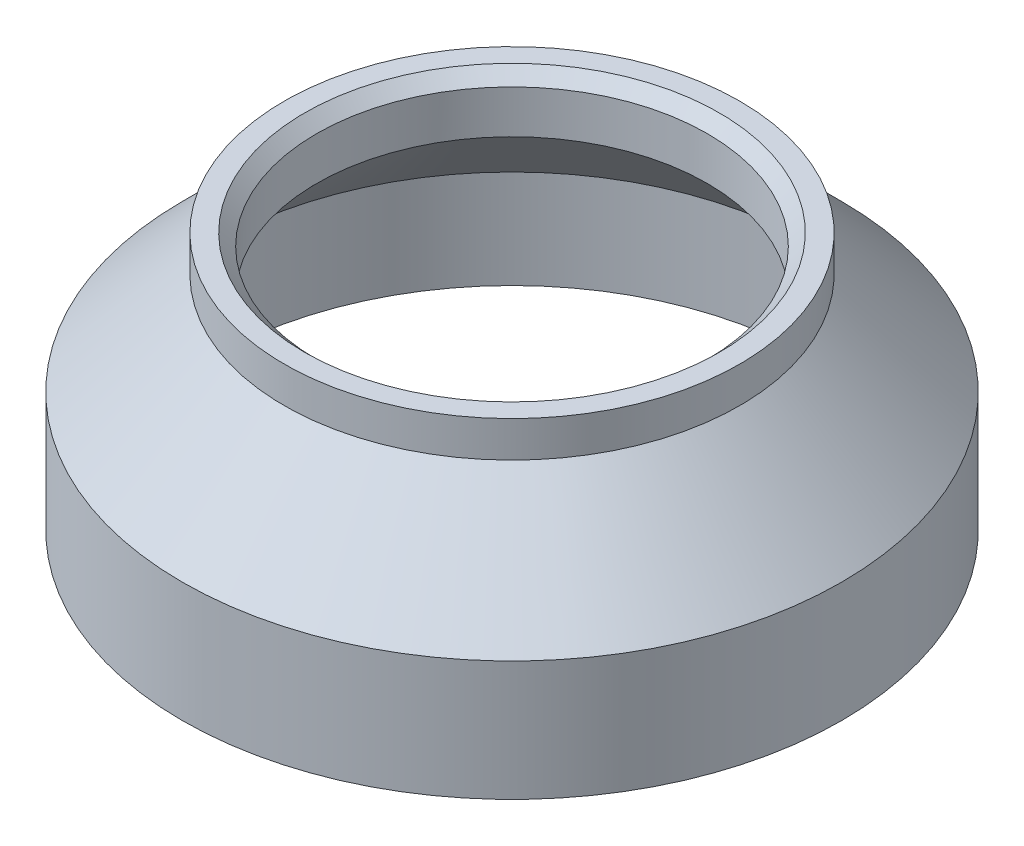
ISO-10303-21;
HEADER;
FILE_DESCRIPTION(('STEP AP214'),'2;1');
FILE_NAME('part.step','',(''),(''),'','','');
FILE_SCHEMA(('AUTOMOTIVE_DESIGN { 1 0 10303 214 1 1 1 1 }'));
ENDSEC;
DATA;
#1=APPLICATION_CONTEXT('core data for automotive mechanical design processes');
#2=APPLICATION_PROTOCOL_DEFINITION('international standard','automotive_design',2000,#1);
#3=PRODUCT_CONTEXT('',#1,'mechanical');
#4=PRODUCT('Part','Part','',(#3));
#5=PRODUCT_RELATED_PRODUCT_CATEGORY('part','',(#4));
#6=PRODUCT_DEFINITION_FORMATION('','',#4);
#7=PRODUCT_DEFINITION_CONTEXT('part definition',#1,'design');
#8=PRODUCT_DEFINITION('design','',#6,#7);
#9=PRODUCT_DEFINITION_SHAPE('','',#8);
#10=(LENGTH_UNIT() NAMED_UNIT(*) SI_UNIT(.MILLI.,.METRE.));
#11=(NAMED_UNIT(*) PLANE_ANGLE_UNIT() SI_UNIT($,.RADIAN.));
#12=(NAMED_UNIT(*) SI_UNIT($,.STERADIAN.) SOLID_ANGLE_UNIT());
#13=UNCERTAINTY_MEASURE_WITH_UNIT(LENGTH_MEASURE(1.E-05),#10,'distance_accuracy_value','');
#14=(GEOMETRIC_REPRESENTATION_CONTEXT(3) GLOBAL_UNCERTAINTY_ASSIGNED_CONTEXT((#13)) GLOBAL_UNIT_ASSIGNED_CONTEXT((#10,
#11,#12)) REPRESENTATION_CONTEXT('',''));
#15=CARTESIAN_POINT('',(0.,0.,0.));
#16=DIRECTION('',(0.,0.,1.));
#17=DIRECTION('',(1.,0.,0.));
#18=AXIS2_PLACEMENT_3D('',#15,#16,#17);
#19=CARTESIAN_POINT('',(0.,0.,0.));
#20=DIRECTION('',(0.,-1.,0.));
#21=DIRECTION('',(0.,0.,-1.));
#22=AXIS2_PLACEMENT_3D('',#19,#20,#21);
#23=CYLINDRICAL_SURFACE('',#22,31.75);
#24=CARTESIAN_POINT('',(0.,7.2389999999999,0.));
#25=DIRECTION('',(0.,-1.,0.));
#26=DIRECTION('',(0.,0.,-1.));
#27=AXIS2_PLACEMENT_3D('',#24,#25,#26);
#28=CIRCLE('',#27,31.75);
#29=CARTESIAN_POINT('',(0.,7.2389999999999,-31.75));
#30=VERTEX_POINT('',#29);
#31=EDGE_CURVE('E67',#30,#30,#28,.T.);
#32=ORIENTED_EDGE('',*,*,#31,.F.);
#33=EDGE_LOOP('',(#32));
#34=FACE_BOUND('',#33,.T.);
#35=CARTESIAN_POINT('',(0.,-3.175,0.));
#36=DIRECTION('',(0.,-1.,0.));
#37=DIRECTION('',(0.,0.,-1.));
#38=AXIS2_PLACEMENT_3D('',#35,#36,#37);
#39=CIRCLE('',#38,31.75);
#40=CARTESIAN_POINT('',(0.,-3.175,-31.75));
#41=VERTEX_POINT('',#40);
#42=EDGE_CURVE('E46',#41,#41,#39,.T.);
#43=ORIENTED_EDGE('',*,*,#42,.T.);
#44=EDGE_LOOP('',(#43));
#45=FACE_BOUND('',#44,.T.);
#46=ADVANCED_FACE('F35',(#34,#45),#23,.F.);
#47=CARTESIAN_POINT('',(0.,-3.175,0.));
#48=DIRECTION('',(0.,1.,0.));
#49=DIRECTION('',(0.,0.,1.));
#50=AXIS2_PLACEMENT_3D('',#47,#48,#49);
#51=PLANE('',#50);
#52=ORIENTED_EDGE('',*,*,#42,.F.);
#53=EDGE_LOOP('',(#52));
#54=FACE_BOUND('',#53,.T.);
#55=CARTESIAN_POINT('',(0.,-3.175,0.));
#56=DIRECTION('',(0.,-1.,0.));
#57=DIRECTION('',(0.,0.,-1.));
#58=AXIS2_PLACEMENT_3D('',#55,#56,#57);
#59=CIRCLE('',#58,34.925);
#60=CARTESIAN_POINT('',(0.,-3.175,-34.925));
#61=VERTEX_POINT('',#60);
#62=EDGE_CURVE('E50',#61,#61,#59,.T.);
#63=ORIENTED_EDGE('',*,*,#62,.T.);
#64=EDGE_LOOP('',(#63));
#65=FACE_BOUND('',#64,.T.);
#66=ADVANCED_FACE('F76',(#54,#65),#51,.F.);
#67=CARTESIAN_POINT('',(0.,0.,0.));
#68=DIRECTION('',(0.,-1.,0.));
#69=DIRECTION('',(0.,0.,-1.));
#70=AXIS2_PLACEMENT_3D('',#67,#68,#69);
#71=CYLINDRICAL_SURFACE('',#70,34.925);
#72=ORIENTED_EDGE('',*,*,#62,.F.);
#73=EDGE_LOOP('',(#72));
#74=FACE_BOUND('',#73,.T.);
#75=CARTESIAN_POINT('',(0.,9.5249999999999,0.));
#76=DIRECTION('',(0.,-1.,0.));
#77=DIRECTION('',(0.,0.,-1.));
#78=AXIS2_PLACEMENT_3D('',#75,#76,#77);
#79=CIRCLE('',#78,34.925);
#80=CARTESIAN_POINT('',(0.,9.5249999999999,-34.925));
#81=VERTEX_POINT('',#80);
#82=EDGE_CURVE('E55',#81,#81,#79,.T.);
#83=ORIENTED_EDGE('',*,*,#82,.T.);
#84=EDGE_LOOP('',(#83));
#85=FACE_BOUND('',#84,.T.);
#86=ADVANCED_FACE('F81',(#74,#85),#71,.T.);
#87=CARTESIAN_POINT('',(0.,9.5249999999999,0.));
#88=DIRECTION('',(0.,-1.,0.));
#89=DIRECTION('',(0.,0.,-1.));
#90=AXIS2_PLACEMENT_3D('',#87,#88,#89);
#91=CONICAL_SURFACE('',#90,34.925,0.785398163397443);
#92=CARTESIAN_POINT('',(0.,20.32,0.));
#93=DIRECTION('',(0.,-1.,0.));
#94=DIRECTION('',(0.,0.,-1.));
#95=AXIS2_PLACEMENT_3D('',#92,#93,#94);
#96=CIRCLE('',#95,24.13);
#97=CARTESIAN_POINT('',(0.,20.32,-24.13));
#98=VERTEX_POINT('',#97);
#99=EDGE_CURVE('E58',#98,#98,#96,.T.);
#100=ORIENTED_EDGE('',*,*,#99,.T.);
#101=EDGE_LOOP('',(#100));
#102=FACE_BOUND('',#101,.T.);
#103=ORIENTED_EDGE('',*,*,#82,.F.);
#104=EDGE_LOOP('',(#103));
#105=FACE_BOUND('',#104,.T.);
#106=ADVANCED_FACE('F87',(#102,#105),#91,.T.);
#107=CARTESIAN_POINT('',(0.,0.,0.));
#108=DIRECTION('',(0.,-1.,0.));
#109=DIRECTION('',(0.,0.,-1.));
#110=AXIS2_PLACEMENT_3D('',#107,#108,#109);
#111=CYLINDRICAL_SURFACE('',#110,24.13);
#112=ORIENTED_EDGE('',*,*,#99,.F.);
#113=EDGE_LOOP('',(#112));
#114=FACE_BOUND('',#113,.T.);
#115=CARTESIAN_POINT('',(0.,24.13,0.));
#116=DIRECTION('',(0.,-1.,0.));
#117=DIRECTION('',(0.,0.,-1.));
#118=AXIS2_PLACEMENT_3D('',#115,#116,#117);
#119=CIRCLE('',#118,24.13);
#120=CARTESIAN_POINT('',(0.,24.13,-24.13));
#121=VERTEX_POINT('',#120);
#122=EDGE_CURVE('E61',#121,#121,#119,.T.);
#123=ORIENTED_EDGE('',*,*,#122,.T.);
#124=EDGE_LOOP('',(#123));
#125=FACE_BOUND('',#124,.T.);
#126=ADVANCED_FACE('F92',(#114,#125),#111,.T.);
#127=CARTESIAN_POINT('',(0.,24.13,0.));
#128=DIRECTION('',(0.,-1.,0.));
#129=DIRECTION('',(0.,0.,-1.));
#130=AXIS2_PLACEMENT_3D('',#127,#128,#129);
#131=PLANE('',#130);
#132=CARTESIAN_POINT('',(0.,24.13,0.));
#133=DIRECTION('',(0.,-1.,0.));
#134=DIRECTION('',(0.,0.,-1.));
#135=AXIS2_PLACEMENT_3D('',#132,#133,#134);
#136=CIRCLE('',#135,21.971);
#137=CARTESIAN_POINT('',(0.,24.13,21.971));
#138=VERTEX_POINT('',#137);
#139=EDGE_CURVE('E42',#138,#138,#136,.T.);
#140=ORIENTED_EDGE('',*,*,#139,.T.);
#141=EDGE_LOOP('',(#140));
#142=FACE_BOUND('',#141,.T.);
#143=ORIENTED_EDGE('',*,*,#122,.F.);
#144=EDGE_LOOP('',(#143));
#145=FACE_BOUND('',#144,.T.);
#146=ADVANCED_FACE('F98',(#142,#145),#131,.F.);
#147=CARTESIAN_POINT('',(0.,0.,0.));
#148=DIRECTION('',(0.,-1.,0.));
#149=DIRECTION('',(0.,0.,-1.));
#150=AXIS2_PLACEMENT_3D('',#147,#148,#149);
#151=CYLINDRICAL_SURFACE('',#150,20.701);
#152=CARTESIAN_POINT('',(0.,22.86,0.));
#153=DIRECTION('',(0.,-1.,0.));
#154=DIRECTION('',(0.,0.,-1.));
#155=AXIS2_PLACEMENT_3D('',#152,#153,#154);
#156=CIRCLE('',#155,20.701);
#157=CARTESIAN_POINT('',(0.,22.86,20.701));
#158=VERTEX_POINT('',#157);
#159=EDGE_CURVE('E10',#158,#158,#156,.F.);
#160=ORIENTED_EDGE('',*,*,#159,.T.);
#161=EDGE_LOOP('',(#160));
#162=FACE_BOUND('',#161,.T.);
#163=CARTESIAN_POINT('',(0.,18.288,0.));
#164=DIRECTION('',(0.,-1.,0.));
#165=DIRECTION('',(0.,0.,-1.));
#166=AXIS2_PLACEMENT_3D('',#163,#164,#165);
#167=CIRCLE('',#166,20.701);
#168=CARTESIAN_POINT('',(0.,18.288,-20.701));
#169=VERTEX_POINT('',#168);
#170=EDGE_CURVE('E64',#169,#169,#167,.T.);
#171=ORIENTED_EDGE('',*,*,#170,.T.);
#172=EDGE_LOOP('',(#171));
#173=FACE_BOUND('',#172,.T.);
#174=ADVANCED_FACE('F104',(#162,#173),#151,.F.);
#175=CARTESIAN_POINT('',(0.,18.288,0.));
#176=DIRECTION('',(0.,-1.,0.));
#177=DIRECTION('',(0.,0.,-1.));
#178=AXIS2_PLACEMENT_3D('',#175,#176,#177);
#179=CONICAL_SURFACE('',#178,20.701,0.785398163397443);
#180=ORIENTED_EDGE('',*,*,#31,.T.);
#181=EDGE_LOOP('',(#180));
#182=FACE_BOUND('',#181,.T.);
#183=ORIENTED_EDGE('',*,*,#170,.F.);
#184=EDGE_LOOP('',(#183));
#185=FACE_BOUND('',#184,.T.);
#186=ADVANCED_FACE('F71',(#182,#185),#179,.F.);
#187=CARTESIAN_POINT('',(0.,24.13,0.));
#188=DIRECTION('',(0.,1.,0.));
#189=DIRECTION('',(0.,0.,1.));
#190=AXIS2_PLACEMENT_3D('',#187,#188,#189);
#191=CONICAL_SURFACE('',#190,21.971,0.785398163397447);
#192=CARTESIAN_POINT('',(0.,22.86,20.701));
#193=CARTESIAN_POINT('',(0.,22.8732291666667,20.7142291666667));
#194=CARTESIAN_POINT('',(0.,22.8864583333333,20.7274583333333));
#195=CARTESIAN_POINT('',(0.,22.9129166666667,20.7539166666667));
#196=CARTESIAN_POINT('',(0.,22.9261458333333,20.7671458333333));
#197=CARTESIAN_POINT('',(0.,22.9526041666667,20.7936041666667));
#198=CARTESIAN_POINT('',(0.,22.9658333333333,20.8068333333333));
#199=CARTESIAN_POINT('',(0.,22.9922916666667,20.8332916666667));
#200=CARTESIAN_POINT('',(0.,23.0055208333333,20.8465208333333));
#201=CARTESIAN_POINT('',(0.,23.0319791666667,20.8729791666667));
#202=CARTESIAN_POINT('',(0.,23.0452083333333,20.8862083333333));
#203=CARTESIAN_POINT('',(0.,23.0716666666667,20.9126666666667));
#204=CARTESIAN_POINT('',(0.,23.0848958333333,20.9258958333333));
#205=CARTESIAN_POINT('',(0.,23.1113541666667,20.9523541666667));
#206=CARTESIAN_POINT('',(0.,23.1245833333333,20.9655833333333));
#207=CARTESIAN_POINT('',(0.,23.1510416666667,20.9920416666667));
#208=CARTESIAN_POINT('',(0.,23.1642708333333,21.0052708333333));
#209=CARTESIAN_POINT('',(0.,23.1907291666667,21.0317291666667));
#210=CARTESIAN_POINT('',(0.,23.2039583333333,21.0449583333333));
#211=CARTESIAN_POINT('',(0.,23.2304166666667,21.0714166666667));
#212=CARTESIAN_POINT('',(0.,23.2436458333333,21.0846458333333));
#213=CARTESIAN_POINT('',(0.,23.2701041666667,21.1111041666667));
#214=CARTESIAN_POINT('',(0.,23.2833333333333,21.1243333333333));
#215=CARTESIAN_POINT('',(0.,23.3097916666667,21.1507916666667));
#216=CARTESIAN_POINT('',(0.,23.3230208333333,21.1640208333333));
#217=CARTESIAN_POINT('',(0.,23.3494791666667,21.1904791666667));
#218=CARTESIAN_POINT('',(0.,23.3627083333333,21.2037083333333));
#219=CARTESIAN_POINT('',(0.,23.3891666666667,21.2301666666667));
#220=CARTESIAN_POINT('',(0.,23.4023958333333,21.2433958333333));
#221=CARTESIAN_POINT('',(0.,23.4288541666667,21.2698541666667));
#222=CARTESIAN_POINT('',(0.,23.4420833333333,21.2830833333333));
#223=CARTESIAN_POINT('',(0.,23.4685416666667,21.3095416666667));
#224=CARTESIAN_POINT('',(0.,23.4817708333333,21.3227708333333));
#225=CARTESIAN_POINT('',(0.,23.5082291666667,21.3492291666667));
#226=CARTESIAN_POINT('',(0.,23.5214583333333,21.3624583333333));
#227=CARTESIAN_POINT('',(0.,23.5479166666667,21.3889166666667));
#228=CARTESIAN_POINT('',(0.,23.5611458333333,21.4021458333333));
#229=CARTESIAN_POINT('',(0.,23.5876041666667,21.4286041666667));
#230=CARTESIAN_POINT('',(0.,23.6008333333333,21.4418333333333));
#231=CARTESIAN_POINT('',(0.,23.6272916666667,21.4682916666667));
#232=CARTESIAN_POINT('',(0.,23.6405208333333,21.4815208333333));
#233=CARTESIAN_POINT('',(0.,23.6669791666667,21.5079791666667));
#234=CARTESIAN_POINT('',(0.,23.6802083333333,21.5212083333333));
#235=CARTESIAN_POINT('',(0.,23.7066666666667,21.5476666666667));
#236=CARTESIAN_POINT('',(0.,23.7198958333333,21.5608958333333));
#237=CARTESIAN_POINT('',(0.,23.7463541666667,21.5873541666667));
#238=CARTESIAN_POINT('',(0.,23.7595833333333,21.6005833333333));
#239=CARTESIAN_POINT('',(0.,23.7860416666667,21.6270416666667));
#240=CARTESIAN_POINT('',(0.,23.7992708333333,21.6402708333333));
#241=CARTESIAN_POINT('',(0.,23.8257291666667,21.6667291666667));
#242=CARTESIAN_POINT('',(0.,23.8389583333333,21.6799583333333));
#243=CARTESIAN_POINT('',(0.,23.8654166666667,21.7064166666667));
#244=CARTESIAN_POINT('',(0.,23.8786458333333,21.7196458333333));
#245=CARTESIAN_POINT('',(0.,23.9051041666667,21.7461041666667));
#246=CARTESIAN_POINT('',(0.,23.9183333333333,21.7593333333333));
#247=CARTESIAN_POINT('',(0.,23.9447916666667,21.7857916666667));
#248=CARTESIAN_POINT('',(0.,23.9580208333333,21.7990208333333));
#249=CARTESIAN_POINT('',(0.,23.9844791666667,21.8254791666667));
#250=CARTESIAN_POINT('',(0.,23.9977083333333,21.8387083333333));
#251=CARTESIAN_POINT('',(0.,24.0241666666667,21.8651666666667));
#252=CARTESIAN_POINT('',(0.,24.0373958333333,21.8783958333333));
#253=CARTESIAN_POINT('',(0.,24.0638541666667,21.9048541666667));
#254=CARTESIAN_POINT('',(0.,24.0770833333333,21.9180833333333));
#255=CARTESIAN_POINT('',(0.,24.1035416666667,21.9445416666667));
#256=CARTESIAN_POINT('',(0.,24.1167708333333,21.9577708333333));
#257=CARTESIAN_POINT('',(0.,24.13,21.971));
#258=B_SPLINE_CURVE_WITH_KNOTS('',3,(#192,#193,#194,#195,#196,#197,#198,#199,#200,#201,#202,
#203,#204,#205,#206,#207,#208,#209,#210,#211,#212,#213,#214,#215,#216,#217,#218,#219,#220,#221,
#222,#223,#224,#225,#226,#227,#228,#229,#230,#231,#232,#233,#234,#235,#236,#237,#238,#239,#240,
#241,#242,#243,#244,#245,#246,#247,#248,#249,#250,#251,#252,#253,#254,#255,#256,#257),
.UNSPECIFIED.,.F.,.F.,(4,2,2,2,2,2,2,2,2,2,2,2,2,2,2,2,2,2,2,2,2,2,2,2,2,2,2,2,2,2,2,2,4),(0.,
0.0561266007566868,0.112253201513369,0.168379802270051,0.224506403026733,0.280633003783414,
0.336759604540096,0.392886205296781,0.449012806053463,0.505139406810145,0.561266007566829,
0.617392608323511,0.673519209080193,0.729645809836875,0.785772410593559,0.841899011350241,
0.898025612106923,0.954152212863607,1.01027881362029,1.06640541437697,1.12253201513366,
1.17865861589034,1.23478521664702,1.2909118174037,1.34703841816038,1.40316501891707,
1.45929161967375,1.51541822043043,1.57154482118712,1.6276714219438,1.68379802270048,
1.73992462345716,1.79605122421384),.UNSPECIFIED.);
#259=EDGE_CURVE('BSEAM37',#158,#138,#258,.T.);
#260=ORIENTED_EDGE('',*,*,#159,.F.);
#261=ORIENTED_EDGE('',*,*,#139,.F.);
#262=ORIENTED_EDGE('',*,*,#259,.T.);
#263=ORIENTED_EDGE('',*,*,#259,.F.);
#264=EDGE_LOOP('',(#260,#262,#261,#263));
#265=FACE_BOUND('',#264,.T.);
#266=ADVANCED_FACE('F37',(#265),#191,.F.);
#267=CLOSED_SHELL('',(#46,#66,#86,#106,#126,#146,#174,#186,#266));
#268=MANIFOLD_SOLID_BREP('B2',#267);
#269=ADVANCED_BREP_SHAPE_REPRESENTATION('',(#18,#268),#14);
#270=SHAPE_DEFINITION_REPRESENTATION(#9,#269);
ENDSEC;
END-ISO-10303-21;
